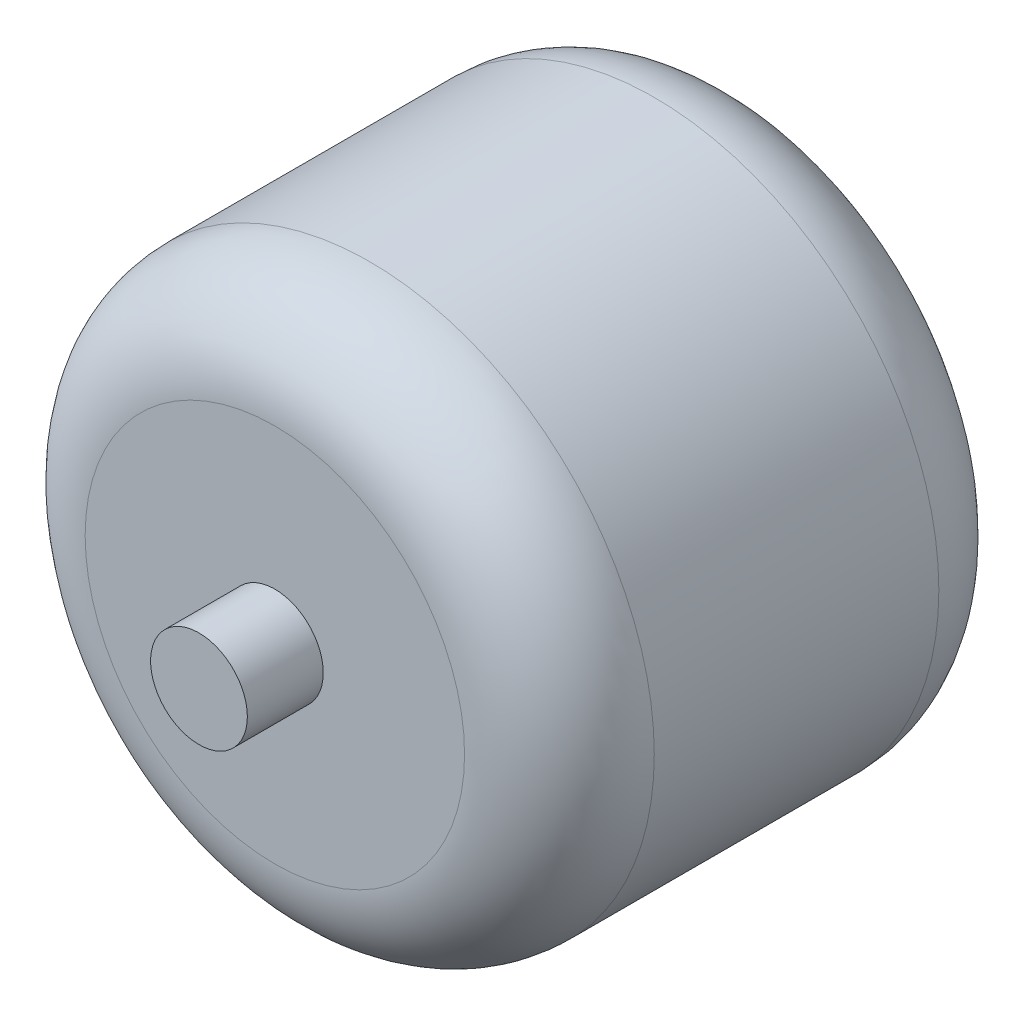
ISO-10303-21;
HEADER;
FILE_DESCRIPTION(('STEP AP214'),'2;1');
FILE_NAME('part.step','',(''),(''),'','','');
FILE_SCHEMA(('AUTOMOTIVE_DESIGN { 1 0 10303 214 1 1 1 1 }'));
ENDSEC;
DATA;
#1=APPLICATION_CONTEXT('core data for automotive mechanical design processes');
#2=APPLICATION_PROTOCOL_DEFINITION('international standard','automotive_design',2000,#1);
#3=PRODUCT_CONTEXT('',#1,'mechanical');
#4=PRODUCT('Part','Part','',(#3));
#5=PRODUCT_RELATED_PRODUCT_CATEGORY('part','',(#4));
#6=PRODUCT_DEFINITION_FORMATION('','',#4);
#7=PRODUCT_DEFINITION_CONTEXT('part definition',#1,'design');
#8=PRODUCT_DEFINITION('design','',#6,#7);
#9=PRODUCT_DEFINITION_SHAPE('','',#8);
#10=(LENGTH_UNIT() NAMED_UNIT(*) SI_UNIT(.MILLI.,.METRE.));
#11=(NAMED_UNIT(*) PLANE_ANGLE_UNIT() SI_UNIT($,.RADIAN.));
#12=(NAMED_UNIT(*) SI_UNIT($,.STERADIAN.) SOLID_ANGLE_UNIT());
#13=UNCERTAINTY_MEASURE_WITH_UNIT(LENGTH_MEASURE(1.E-05),#10,'distance_accuracy_value','');
#14=(GEOMETRIC_REPRESENTATION_CONTEXT(3) GLOBAL_UNCERTAINTY_ASSIGNED_CONTEXT((#13)) GLOBAL_UNIT_ASSIGNED_CONTEXT((#10,
#11,#12)) REPRESENTATION_CONTEXT('',''));
#15=CARTESIAN_POINT('',(0.,0.,0.));
#16=DIRECTION('',(0.,0.,1.));
#17=DIRECTION('',(1.,0.,0.));
#18=AXIS2_PLACEMENT_3D('',#15,#16,#17);
#19=CARTESIAN_POINT('',(0.,0.,25.));
#20=DIRECTION('',(0.,0.,-1.));
#21=DIRECTION('',(-1.,0.,0.));
#22=AXIS2_PLACEMENT_3D('',#19,#20,#21);
#23=CYLINDRICAL_SURFACE('',#22,15.);
#24=CARTESIAN_POINT('',(0.,0.,5.));
#25=DIRECTION('',(0.,0.,1.));
#26=DIRECTION('',(1.,0.,0.));
#27=AXIS2_PLACEMENT_3D('',#24,#25,#26);
#28=CIRCLE('',#27,15.);
#29=CARTESIAN_POINT('',(15.,0.,5.));
#30=VERTEX_POINT('',#29);
#31=EDGE_CURVE('E62',#30,#30,#28,.T.);
#32=ORIENTED_EDGE('',*,*,#31,.T.);
#33=EDGE_LOOP('',(#32));
#34=FACE_BOUND('',#33,.T.);
#35=CARTESIAN_POINT('',(0.,0.,20.));
#36=DIRECTION('',(0.,0.,1.));
#37=DIRECTION('',(1.,0.,0.));
#38=AXIS2_PLACEMENT_3D('',#35,#36,#37);
#39=CIRCLE('',#38,15.);
#40=CARTESIAN_POINT('',(15.,0.,20.));
#41=VERTEX_POINT('',#40);
#42=EDGE_CURVE('E67',#41,#41,#39,.F.);
#43=ORIENTED_EDGE('',*,*,#42,.T.);
#44=EDGE_LOOP('',(#43));
#45=FACE_BOUND('',#44,.T.);
#46=ADVANCED_FACE('F49',(#34,#45),#23,.T.);
#47=CARTESIAN_POINT('',(0.,0.,25.));
#48=DIRECTION('',(0.,0.,1.));
#49=DIRECTION('',(1.,0.,0.));
#50=AXIS2_PLACEMENT_3D('',#47,#48,#49);
#51=PLANE('',#50);
#52=CARTESIAN_POINT('',(0.,0.,25.));
#53=DIRECTION('',(0.,0.,1.));
#54=DIRECTION('',(1.,0.,0.));
#55=AXIS2_PLACEMENT_3D('',#52,#53,#54);
#56=CIRCLE('',#55,2.55);
#57=CARTESIAN_POINT('',(2.55,0.,25.));
#58=VERTEX_POINT('',#57);
#59=EDGE_CURVE('E74',#58,#58,#56,.T.);
#60=ORIENTED_EDGE('',*,*,#59,.F.);
#61=EDGE_LOOP('',(#60));
#62=FACE_BOUND('',#61,.T.);
#63=CARTESIAN_POINT('',(0.,0.,25.));
#64=DIRECTION('',(0.,0.,1.));
#65=DIRECTION('',(1.,0.,0.));
#66=AXIS2_PLACEMENT_3D('',#63,#64,#65);
#67=CIRCLE('',#66,10.);
#68=CARTESIAN_POINT('',(10.,0.,25.));
#69=VERTEX_POINT('',#68);
#70=EDGE_CURVE('E10',#69,#69,#67,.T.);
#71=ORIENTED_EDGE('',*,*,#70,.T.);
#72=EDGE_LOOP('',(#71));
#73=FACE_BOUND('',#72,.T.);
#74=ADVANCED_FACE('F90',(#62,#73),#51,.T.);
#75=CARTESIAN_POINT('',(0.,0.,0.));
#76=DIRECTION('',(0.,0.,1.));
#77=DIRECTION('',(1.,0.,0.));
#78=AXIS2_PLACEMENT_3D('',#75,#76,#77);
#79=PLANE('',#78);
#80=CARTESIAN_POINT('',(0.,0.,0.));
#81=DIRECTION('',(0.,0.,1.));
#82=DIRECTION('',(1.,0.,0.));
#83=AXIS2_PLACEMENT_3D('',#80,#81,#82);
#84=CIRCLE('',#83,10.);
#85=CARTESIAN_POINT('',(10.,0.,0.));
#86=VERTEX_POINT('',#85);
#87=EDGE_CURVE('E57',#86,#86,#84,.F.);
#88=ORIENTED_EDGE('',*,*,#87,.T.);
#89=EDGE_LOOP('',(#88));
#90=FACE_BOUND('',#89,.T.);
#91=ADVANCED_FACE('F92',(#90),#79,.F.);
#92=CARTESIAN_POINT('',(0.,0.,5.));
#93=DIRECTION('',(0.,0.,1.));
#94=DIRECTION('',(1.,0.,0.));
#95=AXIS2_PLACEMENT_3D('',#92,#93,#94);
#96=TOROIDAL_SURFACE('',#95,10.,5.);
#97=ORIENTED_EDGE('',*,*,#87,.F.);
#98=EDGE_LOOP('',(#97));
#99=FACE_BOUND('',#98,.T.);
#100=ORIENTED_EDGE('',*,*,#31,.F.);
#101=EDGE_LOOP('',(#100));
#102=FACE_BOUND('',#101,.T.);
#103=ADVANCED_FACE('F98',(#99,#102),#96,.T.);
#104=CARTESIAN_POINT('',(0.,0.,20.));
#105=DIRECTION('',(0.,0.,1.));
#106=DIRECTION('',(1.,0.,0.));
#107=AXIS2_PLACEMENT_3D('',#104,#105,#106);
#108=TOROIDAL_SURFACE('',#107,10.,5.);
#109=ORIENTED_EDGE('',*,*,#42,.F.);
#110=EDGE_LOOP('',(#109));
#111=FACE_BOUND('',#110,.T.);
#112=ORIENTED_EDGE('',*,*,#70,.F.);
#113=EDGE_LOOP('',(#112));
#114=FACE_BOUND('',#113,.T.);
#115=ADVANCED_FACE('F51',(#111,#114),#108,.T.);
#116=CARTESIAN_POINT('',(0.,0.,29.));
#117=DIRECTION('',(0.,0.,-1.));
#118=DIRECTION('',(-1.,0.,0.));
#119=AXIS2_PLACEMENT_3D('',#116,#117,#118);
#120=CYLINDRICAL_SURFACE('',#119,2.55);
#121=CARTESIAN_POINT('',(0.,0.,29.));
#122=DIRECTION('',(0.,0.,1.));
#123=DIRECTION('',(1.,0.,0.));
#124=AXIS2_PLACEMENT_3D('',#121,#122,#123);
#125=CIRCLE('',#124,2.55);
#126=CARTESIAN_POINT('',(2.55,0.,29.));
#127=VERTEX_POINT('',#126);
#128=EDGE_CURVE('E73',#127,#127,#125,.T.);
#129=ORIENTED_EDGE('',*,*,#128,.F.);
#130=EDGE_LOOP('',(#129));
#131=FACE_BOUND('',#130,.T.);
#132=ORIENTED_EDGE('',*,*,#59,.T.);
#133=EDGE_LOOP('',(#132));
#134=FACE_BOUND('',#133,.T.);
#135=ADVANCED_FACE('F84',(#131,#134),#120,.T.);
#136=CARTESIAN_POINT('',(0.,0.,29.));
#137=DIRECTION('',(0.,0.,1.));
#138=DIRECTION('',(1.,0.,0.));
#139=AXIS2_PLACEMENT_3D('',#136,#137,#138);
#140=PLANE('',#139);
#141=ORIENTED_EDGE('',*,*,#128,.T.);
#142=EDGE_LOOP('',(#141));
#143=FACE_BOUND('',#142,.T.);
#144=ADVANCED_FACE('F82',(#143),#140,.T.);
#145=CLOSED_SHELL('',(#46,#74,#91,#103,#115,#135,#144));
#146=MANIFOLD_SOLID_BREP('B2',#145);
#147=ADVANCED_BREP_SHAPE_REPRESENTATION('',(#18,#146),#14);
#148=SHAPE_DEFINITION_REPRESENTATION(#9,#147);
ENDSEC;
END-ISO-10303-21;
